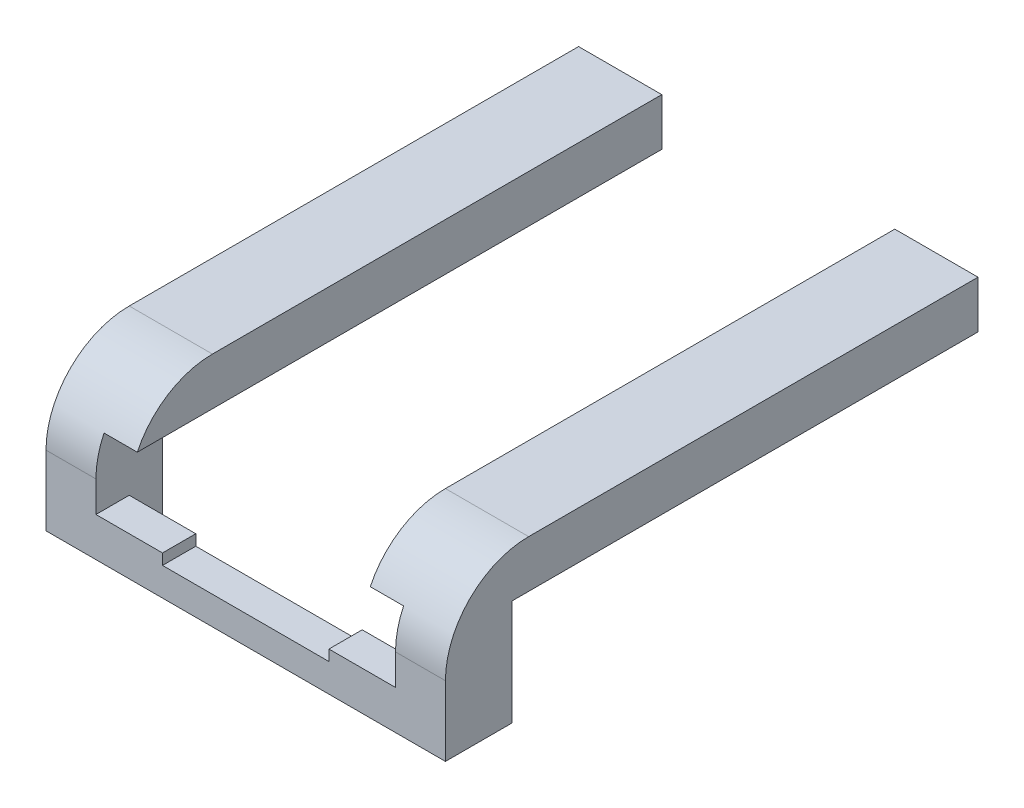
ISO-10303-21;
HEADER;
FILE_DESCRIPTION(('STEP AP214'),'2;1');
FILE_NAME('part.step','',(''),(''),'','','');
FILE_SCHEMA(('AUTOMOTIVE_DESIGN { 1 0 10303 214 1 1 1 1 }'));
ENDSEC;
DATA;
#1=APPLICATION_CONTEXT('core data for automotive mechanical design processes');
#2=APPLICATION_PROTOCOL_DEFINITION('international standard','automotive_design',2000,#1);
#3=PRODUCT_CONTEXT('',#1,'mechanical');
#4=PRODUCT('Part','Part','',(#3));
#5=PRODUCT_RELATED_PRODUCT_CATEGORY('part','',(#4));
#6=PRODUCT_DEFINITION_FORMATION('','',#4);
#7=PRODUCT_DEFINITION_CONTEXT('part definition',#1,'design');
#8=PRODUCT_DEFINITION('design','',#6,#7);
#9=PRODUCT_DEFINITION_SHAPE('','',#8);
#10=(LENGTH_UNIT() NAMED_UNIT(*) SI_UNIT(.MILLI.,.METRE.));
#11=(NAMED_UNIT(*) PLANE_ANGLE_UNIT() SI_UNIT($,.RADIAN.));
#12=(NAMED_UNIT(*) SI_UNIT($,.STERADIAN.) SOLID_ANGLE_UNIT());
#13=UNCERTAINTY_MEASURE_WITH_UNIT(LENGTH_MEASURE(1.E-05),#10,'distance_accuracy_value','');
#14=(GEOMETRIC_REPRESENTATION_CONTEXT(3) GLOBAL_UNCERTAINTY_ASSIGNED_CONTEXT((#13)) GLOBAL_UNIT_ASSIGNED_CONTEXT((#10,
#11,#12)) REPRESENTATION_CONTEXT('',''));
#15=CARTESIAN_POINT('',(0.,0.,0.));
#16=DIRECTION('',(0.,0.,1.));
#17=DIRECTION('',(1.,0.,0.));
#18=AXIS2_PLACEMENT_3D('',#15,#16,#17);
#19=CARTESIAN_POINT('',(0.,1.7,0.));
#20=DIRECTION('',(0.,1.,0.));
#21=DIRECTION('',(0.,0.,1.));
#22=AXIS2_PLACEMENT_3D('',#19,#20,#21);
#23=PLANE('',#22);
#24=DIRECTION('',(1.,0.,0.));
#25=VECTOR('',#24,1.);
#26=CARTESIAN_POINT('',(-12.,1.7,0.));
#27=LINE('',#26,#25);
#28=CARTESIAN_POINT('',(-5.,1.7,0.));
#29=VERTEX_POINT('',#28);
#30=CARTESIAN_POINT('',(5.,1.7,0.));
#31=VERTEX_POINT('',#30);
#32=EDGE_CURVE('E48',#29,#31,#27,.T.);
#33=ORIENTED_EDGE('',*,*,#32,.T.);
#34=DIRECTION('',(0.,0.,1.));
#35=VECTOR('',#34,1.);
#36=CARTESIAN_POINT('',(5.,1.7,0.));
#37=LINE('',#36,#35);
#38=CARTESIAN_POINT('',(5.,1.7,-2.));
#39=VERTEX_POINT('',#38);
#40=EDGE_CURVE('E207',#39,#31,#37,.T.);
#41=ORIENTED_EDGE('',*,*,#40,.F.);
#42=DIRECTION('',(-1.,0.,0.));
#43=VECTOR('',#42,1.);
#44=CARTESIAN_POINT('',(-9.,1.7,-2.));
#45=LINE('',#44,#43);
#46=CARTESIAN_POINT('',(-5.,1.7,-2.));
#47=VERTEX_POINT('',#46);
#48=EDGE_CURVE('E195',#39,#47,#45,.T.);
#49=ORIENTED_EDGE('',*,*,#48,.T.);
#50=DIRECTION('',(0.,0.,-1.));
#51=VECTOR('',#50,1.);
#52=CARTESIAN_POINT('',(-5.,1.7,0.));
#53=LINE('',#52,#51);
#54=EDGE_CURVE('E197',#29,#47,#53,.T.);
#55=ORIENTED_EDGE('',*,*,#54,.F.);
#56=EDGE_LOOP('',(#33,#41,#49,#55));
#57=FACE_BOUND('',#56,.T.);
#58=ADVANCED_FACE('F33',(#57),#23,.T.);
#59=CARTESIAN_POINT('',(9.,1.7,-4.));
#60=DIRECTION('',(1.,0.,0.));
#61=DIRECTION('',(0.,0.,-1.));
#62=AXIS2_PLACEMENT_3D('',#59,#60,#61);
#63=PLANE('',#62);
#64=DIRECTION('',(0.,-1.,0.));
#65=VECTOR('',#64,1.);
#66=CARTESIAN_POINT('',(9.,1.7,-2.));
#67=LINE('',#66,#65);
#68=CARTESIAN_POINT('',(9.,2.35,-2.));
#69=VERTEX_POINT('',#68);
#70=CARTESIAN_POINT('',(9.,0.,-2.));
#71=VERTEX_POINT('',#70);
#72=EDGE_CURVE('E56',#69,#71,#67,.T.);
#73=ORIENTED_EDGE('',*,*,#72,.F.);
#74=DIRECTION('',(0.,0.,-1.));
#75=VECTOR('',#74,1.);
#76=CARTESIAN_POINT('',(9.,2.35,0.));
#77=LINE('',#76,#75);
#78=CARTESIAN_POINT('',(9.,2.35,0.));
#79=VERTEX_POINT('',#78);
#80=EDGE_CURVE('E188',#79,#69,#77,.T.);
#81=ORIENTED_EDGE('',*,*,#80,.F.);
#82=DIRECTION('',(0.,-1.,0.));
#83=VECTOR('',#82,1.);
#84=CARTESIAN_POINT('',(9.,9.2,0.));
#85=LINE('',#84,#83);
#86=CARTESIAN_POINT('',(9.,4.2,0.));
#87=VERTEX_POINT('',#86);
#88=EDGE_CURVE('E273',#87,#79,#85,.T.);
#89=ORIENTED_EDGE('',*,*,#88,.F.);
#90=CARTESIAN_POINT('',(9.,4.2,-5.));
#91=DIRECTION('',(1.,0.,0.));
#92=DIRECTION('',(0.,0.,-1.));
#93=AXIS2_PLACEMENT_3D('',#90,#91,#92);
#94=CIRCLE('',#93,5.);
#95=CARTESIAN_POINT('',(9.00000000000001,6.35,-0.485855562789335));
#96=VERTEX_POINT('',#95);
#97=EDGE_CURVE('E335',#87,#96,#94,.F.);
#98=ORIENTED_EDGE('',*,*,#97,.T.);
#99=DIRECTION('',(0.,0.,-1.));
#100=VECTOR('',#99,1.);
#101=CARTESIAN_POINT('',(9.,6.35,-4.));
#102=LINE('',#101,#100);
#103=CARTESIAN_POINT('',(9.,6.35,-4.));
#104=VERTEX_POINT('',#103);
#105=EDGE_CURVE('E324',#96,#104,#102,.T.);
#106=ORIENTED_EDGE('',*,*,#105,.T.);
#107=DIRECTION('',(0.,-1.,0.));
#108=VECTOR('',#107,1.);
#109=CARTESIAN_POINT('',(9.,1.7,-4.));
#110=LINE('',#109,#108);
#111=CARTESIAN_POINT('',(9.,0.,-4.));
#112=VERTEX_POINT('',#111);
#113=EDGE_CURVE('E313',#104,#112,#110,.T.);
#114=ORIENTED_EDGE('',*,*,#113,.T.);
#115=DIRECTION('',(0.,0.,1.));
#116=VECTOR('',#115,1.);
#117=CARTESIAN_POINT('',(9.,0.,-4.));
#118=LINE('',#117,#116);
#119=EDGE_CURVE('E297',#112,#71,#118,.T.);
#120=ORIENTED_EDGE('',*,*,#119,.T.);
#121=EDGE_LOOP('',(#73,#81,#89,#98,#106,#114,#120));
#122=FACE_BOUND('',#121,.T.);
#123=ADVANCED_FACE('F400',(#122),#63,.F.);
#124=CARTESIAN_POINT('',(-9.,1.7,-4.));
#125=DIRECTION('',(-1.,0.,0.));
#126=DIRECTION('',(0.,0.,1.));
#127=AXIS2_PLACEMENT_3D('',#124,#125,#126);
#128=PLANE('',#127);
#129=DIRECTION('',(0.,0.,1.));
#130=VECTOR('',#129,1.);
#131=CARTESIAN_POINT('',(-9.,2.35,0.));
#132=LINE('',#131,#130);
#133=CARTESIAN_POINT('',(-9.,2.35,-2.));
#134=VERTEX_POINT('',#133);
#135=CARTESIAN_POINT('',(-9.,2.35,0.));
#136=VERTEX_POINT('',#135);
#137=EDGE_CURVE('E210',#134,#136,#132,.T.);
#138=ORIENTED_EDGE('',*,*,#137,.F.);
#139=DIRECTION('',(0.,-1.,0.));
#140=VECTOR('',#139,1.);
#141=CARTESIAN_POINT('',(-9.,1.7,-2.));
#142=LINE('',#141,#140);
#143=CARTESIAN_POINT('',(-9.,0.,-2.));
#144=VERTEX_POINT('',#143);
#145=EDGE_CURVE('E309',#134,#144,#142,.T.);
#146=ORIENTED_EDGE('',*,*,#145,.T.);
#147=DIRECTION('',(0.,0.,-1.));
#148=VECTOR('',#147,1.);
#149=CARTESIAN_POINT('',(-9.,0.,-4.));
#150=LINE('',#149,#148);
#151=CARTESIAN_POINT('',(-9.,0.,-4.));
#152=VERTEX_POINT('',#151);
#153=EDGE_CURVE('E301',#144,#152,#150,.T.);
#154=ORIENTED_EDGE('',*,*,#153,.T.);
#155=DIRECTION('',(0.,-1.,0.));
#156=VECTOR('',#155,1.);
#157=CARTESIAN_POINT('',(-9.,1.7,-4.));
#158=LINE('',#157,#156);
#159=CARTESIAN_POINT('',(-9.,6.35,-4.));
#160=VERTEX_POINT('',#159);
#161=EDGE_CURVE('E307',#160,#152,#158,.T.);
#162=ORIENTED_EDGE('',*,*,#161,.F.);
#163=DIRECTION('',(0.,0.,1.));
#164=VECTOR('',#163,1.);
#165=CARTESIAN_POINT('',(-9.,6.35,-4.));
#166=LINE('',#165,#164);
#167=CARTESIAN_POINT('',(-9.00000000000001,6.35,-0.485855562789335));
#168=VERTEX_POINT('',#167);
#169=EDGE_CURVE('E266',#160,#168,#166,.T.);
#170=ORIENTED_EDGE('',*,*,#169,.T.);
#171=CARTESIAN_POINT('',(-9.,4.2,-5.));
#172=DIRECTION('',(-1.,0.,0.));
#173=DIRECTION('',(0.,0.,1.));
#174=AXIS2_PLACEMENT_3D('',#171,#172,#173);
#175=CIRCLE('',#174,5.);
#176=CARTESIAN_POINT('',(-9.,4.2,0.));
#177=VERTEX_POINT('',#176);
#178=EDGE_CURVE('E41',#168,#177,#175,.F.);
#179=ORIENTED_EDGE('',*,*,#178,.T.);
#180=DIRECTION('',(0.,-1.,0.));
#181=VECTOR('',#180,1.);
#182=CARTESIAN_POINT('',(-9.,9.2,0.));
#183=LINE('',#182,#181);
#184=EDGE_CURVE('E279',#177,#136,#183,.T.);
#185=ORIENTED_EDGE('',*,*,#184,.T.);
#186=EDGE_LOOP('',(#138,#146,#154,#162,#170,#179,#185));
#187=FACE_BOUND('',#186,.T.);
#188=ADVANCED_FACE('F351',(#187),#128,.F.);
#189=CARTESIAN_POINT('',(-12.,1.7,-4.));
#190=DIRECTION('',(1.,0.,0.));
#191=DIRECTION('',(0.,0.,-1.));
#192=AXIS2_PLACEMENT_3D('',#189,#190,#191);
#193=PLANE('',#192);
#194=DIRECTION('',(0.,-1.,0.));
#195=VECTOR('',#194,1.);
#196=CARTESIAN_POINT('',(-12.,1.7,0.));
#197=LINE('',#196,#195);
#198=CARTESIAN_POINT('',(-12.,4.2,0.));
#199=VERTEX_POINT('',#198);
#200=CARTESIAN_POINT('',(-12.,0.,0.));
#201=VERTEX_POINT('',#200);
#202=EDGE_CURVE('E319',#199,#201,#197,.T.);
#203=ORIENTED_EDGE('',*,*,#202,.F.);
#204=CARTESIAN_POINT('',(-12.,4.2,-5.));
#205=DIRECTION('',(1.,0.,0.));
#206=DIRECTION('',(0.,0.,-1.));
#207=AXIS2_PLACEMENT_3D('',#204,#205,#206);
#208=CIRCLE('',#207,5.);
#209=CARTESIAN_POINT('',(-12.,9.2,-5.));
#210=VERTEX_POINT('',#209);
#211=EDGE_CURVE('E11',#199,#210,#208,.F.);
#212=ORIENTED_EDGE('',*,*,#211,.T.);
#213=DIRECTION('',(0.,0.,1.));
#214=VECTOR('',#213,1.);
#215=CARTESIAN_POINT('',(-12.,9.2,-4.));
#216=LINE('',#215,#214);
#217=CARTESIAN_POINT('',(-12.,9.2,-32.));
#218=VERTEX_POINT('',#217);
#219=EDGE_CURVE('E276',#218,#210,#216,.T.);
#220=ORIENTED_EDGE('',*,*,#219,.F.);
#221=DIRECTION('',(0.,1.,0.));
#222=VECTOR('',#221,1.);
#223=CARTESIAN_POINT('',(-12.,6.35,-32.));
#224=LINE('',#223,#222);
#225=CARTESIAN_POINT('',(-12.,6.35,-32.));
#226=VERTEX_POINT('',#225);
#227=EDGE_CURVE('E263',#226,#218,#224,.T.);
#228=ORIENTED_EDGE('',*,*,#227,.F.);
#229=DIRECTION('',(0.,0.,1.));
#230=VECTOR('',#229,1.);
#231=CARTESIAN_POINT('',(-12.,6.35,0.));
#232=LINE('',#231,#230);
#233=CARTESIAN_POINT('',(-12.,6.35,-4.));
#234=VERTEX_POINT('',#233);
#235=EDGE_CURVE('E250',#226,#234,#232,.T.);
#236=ORIENTED_EDGE('',*,*,#235,.T.);
#237=DIRECTION('',(0.,-1.,0.));
#238=VECTOR('',#237,1.);
#239=CARTESIAN_POINT('',(-12.,1.7,-4.));
#240=LINE('',#239,#238);
#241=CARTESIAN_POINT('',(-12.,0.,-4.));
#242=VERTEX_POINT('',#241);
#243=EDGE_CURVE('E285',#234,#242,#240,.T.);
#244=ORIENTED_EDGE('',*,*,#243,.T.);
#245=DIRECTION('',(0.,0.,1.));
#246=VECTOR('',#245,1.);
#247=CARTESIAN_POINT('',(-12.,0.,-4.));
#248=LINE('',#247,#246);
#249=EDGE_CURVE('E281',#242,#201,#248,.T.);
#250=ORIENTED_EDGE('',*,*,#249,.T.);
#251=EDGE_LOOP('',(#203,#212,#220,#228,#236,#244,#250));
#252=FACE_BOUND('',#251,.T.);
#253=ADVANCED_FACE('F364',(#252),#193,.F.);
#254=CARTESIAN_POINT('',(-12.,1.7,0.));
#255=DIRECTION('',(0.,0.,-1.));
#256=DIRECTION('',(-1.,0.,0.));
#257=AXIS2_PLACEMENT_3D('',#254,#255,#256);
#258=PLANE('',#257);
#259=ORIENTED_EDGE('',*,*,#32,.F.);
#260=DIRECTION('',(0.,-1.,0.));
#261=VECTOR('',#260,1.);
#262=CARTESIAN_POINT('',(-5.,2.35,0.));
#263=LINE('',#262,#261);
#264=CARTESIAN_POINT('',(-5.,2.35,0.));
#265=VERTEX_POINT('',#264);
#266=EDGE_CURVE('E224',#265,#29,#263,.T.);
#267=ORIENTED_EDGE('',*,*,#266,.F.);
#268=DIRECTION('',(1.,0.,0.));
#269=VECTOR('',#268,1.);
#270=CARTESIAN_POINT('',(-9.,2.35,0.));
#271=LINE('',#270,#269);
#272=EDGE_CURVE('E213',#136,#265,#271,.T.);
#273=ORIENTED_EDGE('',*,*,#272,.F.);
#274=ORIENTED_EDGE('',*,*,#184,.F.);
#275=DIRECTION('',(1.,0.,0.));
#276=VECTOR('',#275,1.);
#277=CARTESIAN_POINT('',(-12.,4.2,0.));
#278=LINE('',#277,#276);
#279=EDGE_CURVE('E331',#177,#199,#278,.F.);
#280=ORIENTED_EDGE('',*,*,#279,.T.);
#281=ORIENTED_EDGE('',*,*,#202,.T.);
#282=DIRECTION('',(1.,0.,0.));
#283=VECTOR('',#282,1.);
#284=CARTESIAN_POINT('',(-12.,0.,0.));
#285=LINE('',#284,#283);
#286=CARTESIAN_POINT('',(12.,0.,0.));
#287=VERTEX_POINT('',#286);
#288=EDGE_CURVE('E288',#201,#287,#285,.T.);
#289=ORIENTED_EDGE('',*,*,#288,.T.);
#290=DIRECTION('',(0.,-1.,0.));
#291=VECTOR('',#290,1.);
#292=CARTESIAN_POINT('',(12.,1.7,0.));
#293=LINE('',#292,#291);
#294=CARTESIAN_POINT('',(12.,4.2,0.));
#295=VERTEX_POINT('',#294);
#296=EDGE_CURVE('E317',#295,#287,#293,.T.);
#297=ORIENTED_EDGE('',*,*,#296,.F.);
#298=DIRECTION('',(1.,0.,0.));
#299=VECTOR('',#298,1.);
#300=CARTESIAN_POINT('',(7.,4.2,0.));
#301=LINE('',#300,#299);
#302=EDGE_CURVE('E333',#295,#87,#301,.F.);
#303=ORIENTED_EDGE('',*,*,#302,.T.);
#304=ORIENTED_EDGE('',*,*,#88,.T.);
#305=DIRECTION('',(1.,0.,0.));
#306=VECTOR('',#305,1.);
#307=CARTESIAN_POINT('',(9.,2.35,0.));
#308=LINE('',#307,#306);
#309=CARTESIAN_POINT('',(5.,2.35,0.));
#310=VERTEX_POINT('',#309);
#311=EDGE_CURVE('E208',#310,#79,#308,.T.);
#312=ORIENTED_EDGE('',*,*,#311,.F.);
#313=DIRECTION('',(0.,-1.,0.));
#314=VECTOR('',#313,1.);
#315=CARTESIAN_POINT('',(5.,2.35,0.));
#316=LINE('',#315,#314);
#317=EDGE_CURVE('E198',#310,#31,#316,.T.);
#318=ORIENTED_EDGE('',*,*,#317,.T.);
#319=EDGE_LOOP('',(#259,#267,#273,#274,#280,#281,#289,#297,#303,#304,#312,#318));
#320=FACE_BOUND('',#319,.T.);
#321=ADVANCED_FACE('F358',(#320),#258,.F.);
#322=CARTESIAN_POINT('',(12.,1.7,-4.));
#323=DIRECTION('',(-1.,0.,0.));
#324=DIRECTION('',(0.,0.,1.));
#325=AXIS2_PLACEMENT_3D('',#322,#323,#324);
#326=PLANE('',#325);
#327=DIRECTION('',(0.,0.,-1.));
#328=VECTOR('',#327,1.);
#329=CARTESIAN_POINT('',(12.,9.2,-4.));
#330=LINE('',#329,#328);
#331=CARTESIAN_POINT('',(12.,9.2,-5.));
#332=VERTEX_POINT('',#331);
#333=CARTESIAN_POINT('',(12.,9.2,-32.));
#334=VERTEX_POINT('',#333);
#335=EDGE_CURVE('E271',#332,#334,#330,.T.);
#336=ORIENTED_EDGE('',*,*,#335,.F.);
#337=CARTESIAN_POINT('',(12.,4.2,-5.));
#338=DIRECTION('',(-1.,0.,0.));
#339=DIRECTION('',(0.,0.,1.));
#340=AXIS2_PLACEMENT_3D('',#337,#338,#339);
#341=CIRCLE('',#340,5.);
#342=EDGE_CURVE('E329',#332,#295,#341,.F.);
#343=ORIENTED_EDGE('',*,*,#342,.T.);
#344=ORIENTED_EDGE('',*,*,#296,.T.);
#345=DIRECTION('',(0.,0.,-1.));
#346=VECTOR('',#345,1.);
#347=CARTESIAN_POINT('',(12.,0.,-4.));
#348=LINE('',#347,#346);
#349=CARTESIAN_POINT('',(12.,0.,-4.));
#350=VERTEX_POINT('',#349);
#351=EDGE_CURVE('E291',#287,#350,#348,.T.);
#352=ORIENTED_EDGE('',*,*,#351,.T.);
#353=DIRECTION('',(0.,-1.,0.));
#354=VECTOR('',#353,1.);
#355=CARTESIAN_POINT('',(12.,1.7,-4.));
#356=LINE('',#355,#354);
#357=CARTESIAN_POINT('',(12.,6.35,-4.));
#358=VERTEX_POINT('',#357);
#359=EDGE_CURVE('E315',#358,#350,#356,.T.);
#360=ORIENTED_EDGE('',*,*,#359,.F.);
#361=DIRECTION('',(0.,0.,-1.));
#362=VECTOR('',#361,1.);
#363=CARTESIAN_POINT('',(12.,6.35,0.));
#364=LINE('',#363,#362);
#365=CARTESIAN_POINT('',(12.,6.35,-32.));
#366=VERTEX_POINT('',#365);
#367=EDGE_CURVE('E228',#358,#366,#364,.T.);
#368=ORIENTED_EDGE('',*,*,#367,.T.);
#369=DIRECTION('',(0.,1.,0.));
#370=VECTOR('',#369,1.);
#371=CARTESIAN_POINT('',(12.,6.35,-32.));
#372=LINE('',#371,#370);
#373=EDGE_CURVE('E237',#366,#334,#372,.T.);
#374=ORIENTED_EDGE('',*,*,#373,.T.);
#375=EDGE_LOOP('',(#336,#343,#344,#352,#360,#368,#374));
#376=FACE_BOUND('',#375,.T.);
#377=ADVANCED_FACE('F439',(#376),#326,.F.);
#378=CARTESIAN_POINT('',(12.,1.7,-4.));
#379=DIRECTION('',(0.,0.,1.));
#380=DIRECTION('',(1.,0.,0.));
#381=AXIS2_PLACEMENT_3D('',#378,#379,#380);
#382=PLANE('',#381);
#383=ORIENTED_EDGE('',*,*,#113,.F.);
#384=DIRECTION('',(1.,0.,0.));
#385=VECTOR('',#384,1.);
#386=CARTESIAN_POINT('',(12.,6.35,-4.));
#387=LINE('',#386,#385);
#388=EDGE_CURVE('E244',#104,#358,#387,.T.);
#389=ORIENTED_EDGE('',*,*,#388,.T.);
#390=ORIENTED_EDGE('',*,*,#359,.T.);
#391=DIRECTION('',(-1.,0.,0.));
#392=VECTOR('',#391,1.);
#393=CARTESIAN_POINT('',(12.,0.,-4.));
#394=LINE('',#393,#392);
#395=EDGE_CURVE('E294',#350,#112,#394,.T.);
#396=ORIENTED_EDGE('',*,*,#395,.T.);
#397=EDGE_LOOP('',(#383,#389,#390,#396));
#398=FACE_BOUND('',#397,.T.);
#399=ADVANCED_FACE('F409',(#398),#382,.F.);
#400=CARTESIAN_POINT('',(-9.,1.7,-2.));
#401=DIRECTION('',(0.,0.,1.));
#402=DIRECTION('',(1.,0.,0.));
#403=AXIS2_PLACEMENT_3D('',#400,#401,#402);
#404=PLANE('',#403);
#405=DIRECTION('',(-1.,0.,0.));
#406=VECTOR('',#405,1.);
#407=CARTESIAN_POINT('',(-9.,0.,-2.));
#408=LINE('',#407,#406);
#409=EDGE_CURVE('E299',#71,#144,#408,.T.);
#410=ORIENTED_EDGE('',*,*,#409,.T.);
#411=ORIENTED_EDGE('',*,*,#145,.F.);
#412=DIRECTION('',(-1.,0.,0.));
#413=VECTOR('',#412,1.);
#414=CARTESIAN_POINT('',(-9.,2.35,-2.));
#415=LINE('',#414,#413);
#416=CARTESIAN_POINT('',(-5.,2.35,-2.));
#417=VERTEX_POINT('',#416);
#418=EDGE_CURVE('E217',#417,#134,#415,.T.);
#419=ORIENTED_EDGE('',*,*,#418,.F.);
#420=DIRECTION('',(0.,-1.,0.));
#421=VECTOR('',#420,1.);
#422=CARTESIAN_POINT('',(-5.,2.35,-2.));
#423=LINE('',#422,#421);
#424=EDGE_CURVE('E220',#417,#47,#423,.T.);
#425=ORIENTED_EDGE('',*,*,#424,.T.);
#426=ORIENTED_EDGE('',*,*,#48,.F.);
#427=DIRECTION('',(0.,-1.,0.));
#428=VECTOR('',#427,1.);
#429=CARTESIAN_POINT('',(5.,2.35,-2.));
#430=LINE('',#429,#428);
#431=CARTESIAN_POINT('',(5.,2.35,-2.));
#432=VERTEX_POINT('',#431);
#433=EDGE_CURVE('E192',#432,#39,#430,.T.);
#434=ORIENTED_EDGE('',*,*,#433,.F.);
#435=DIRECTION('',(-1.,0.,0.));
#436=VECTOR('',#435,1.);
#437=CARTESIAN_POINT('',(9.,2.35,-2.));
#438=LINE('',#437,#436);
#439=EDGE_CURVE('E181',#69,#432,#438,.T.);
#440=ORIENTED_EDGE('',*,*,#439,.F.);
#441=ORIENTED_EDGE('',*,*,#72,.T.);
#442=EDGE_LOOP('',(#410,#411,#419,#425,#426,#434,#440,#441));
#443=FACE_BOUND('',#442,.T.);
#444=ADVANCED_FACE('F193',(#443),#404,.F.);
#445=CARTESIAN_POINT('',(-12.,1.7,-4.));
#446=DIRECTION('',(0.,0.,1.));
#447=DIRECTION('',(1.,0.,0.));
#448=AXIS2_PLACEMENT_3D('',#445,#446,#447);
#449=PLANE('',#448);
#450=ORIENTED_EDGE('',*,*,#243,.F.);
#451=DIRECTION('',(1.,0.,0.));
#452=VECTOR('',#451,1.);
#453=CARTESIAN_POINT('',(-12.,6.35,-4.));
#454=LINE('',#453,#452);
#455=EDGE_CURVE('E321',#234,#160,#454,.T.);
#456=ORIENTED_EDGE('',*,*,#455,.T.);
#457=ORIENTED_EDGE('',*,*,#161,.T.);
#458=DIRECTION('',(-1.,0.,0.));
#459=VECTOR('',#458,1.);
#460=CARTESIAN_POINT('',(-12.,0.,-4.));
#461=LINE('',#460,#459);
#462=EDGE_CURVE('E283',#152,#242,#461,.T.);
#463=ORIENTED_EDGE('',*,*,#462,.T.);
#464=EDGE_LOOP('',(#450,#456,#457,#463));
#465=FACE_BOUND('',#464,.T.);
#466=ADVANCED_FACE('F379',(#465),#449,.F.);
#467=CARTESIAN_POINT('',(0.,0.,0.));
#468=DIRECTION('',(0.,1.,0.));
#469=DIRECTION('',(0.,0.,1.));
#470=AXIS2_PLACEMENT_3D('',#467,#468,#469);
#471=PLANE('',#470);
#472=ORIENTED_EDGE('',*,*,#249,.F.);
#473=ORIENTED_EDGE('',*,*,#462,.F.);
#474=ORIENTED_EDGE('',*,*,#153,.F.);
#475=ORIENTED_EDGE('',*,*,#409,.F.);
#476=ORIENTED_EDGE('',*,*,#119,.F.);
#477=ORIENTED_EDGE('',*,*,#395,.F.);
#478=ORIENTED_EDGE('',*,*,#351,.F.);
#479=ORIENTED_EDGE('',*,*,#288,.F.);
#480=EDGE_LOOP('',(#472,#473,#474,#475,#476,#477,#478,#479));
#481=FACE_BOUND('',#480,.T.);
#482=ADVANCED_FACE('F385',(#481),#471,.F.);
#483=CARTESIAN_POINT('',(0.,9.2,0.));
#484=DIRECTION('',(0.,1.,0.));
#485=DIRECTION('',(0.,0.,1.));
#486=AXIS2_PLACEMENT_3D('',#483,#484,#485);
#487=PLANE('',#486);
#488=ORIENTED_EDGE('',*,*,#219,.T.);
#489=DIRECTION('',(1.,0.,0.));
#490=VECTOR('',#489,1.);
#491=CARTESIAN_POINT('',(-7.,9.2,-5.));
#492=LINE('',#491,#490);
#493=CARTESIAN_POINT('',(-7.,9.2,-5.));
#494=VERTEX_POINT('',#493);
#495=EDGE_CURVE('E341',#210,#494,#492,.T.);
#496=ORIENTED_EDGE('',*,*,#495,.T.);
#497=DIRECTION('',(0.,0.,-1.));
#498=VECTOR('',#497,1.);
#499=CARTESIAN_POINT('',(-7.,9.2,0.));
#500=LINE('',#499,#498);
#501=CARTESIAN_POINT('',(-7.,9.2,-32.));
#502=VERTEX_POINT('',#501);
#503=EDGE_CURVE('E249',#494,#502,#500,.T.);
#504=ORIENTED_EDGE('',*,*,#503,.T.);
#505=DIRECTION('',(-1.,0.,0.));
#506=VECTOR('',#505,1.);
#507=CARTESIAN_POINT('',(-12.,9.2,-32.));
#508=LINE('',#507,#506);
#509=EDGE_CURVE('E254',#502,#218,#508,.T.);
#510=ORIENTED_EDGE('',*,*,#509,.T.);
#511=EDGE_LOOP('',(#488,#496,#504,#510));
#512=FACE_BOUND('',#511,.T.);
#513=ADVANCED_FACE('F366',(#512),#487,.T.);
#514=CARTESIAN_POINT('',(0.,9.2,0.));
#515=DIRECTION('',(0.,1.,0.));
#516=DIRECTION('',(0.,0.,1.));
#517=AXIS2_PLACEMENT_3D('',#514,#515,#516);
#518=PLANE('',#517);
#519=DIRECTION('',(0.,0.,1.));
#520=VECTOR('',#519,1.);
#521=CARTESIAN_POINT('',(7.,9.2,0.));
#522=LINE('',#521,#520);
#523=CARTESIAN_POINT('',(7.,9.2,-32.));
#524=VERTEX_POINT('',#523);
#525=CARTESIAN_POINT('',(7.,9.2,-5.));
#526=VERTEX_POINT('',#525);
#527=EDGE_CURVE('E231',#524,#526,#522,.T.);
#528=ORIENTED_EDGE('',*,*,#527,.T.);
#529=DIRECTION('',(1.,0.,0.));
#530=VECTOR('',#529,1.);
#531=CARTESIAN_POINT('',(12.,9.2,-5.));
#532=LINE('',#531,#530);
#533=EDGE_CURVE('E326',#526,#332,#532,.T.);
#534=ORIENTED_EDGE('',*,*,#533,.T.);
#535=ORIENTED_EDGE('',*,*,#335,.T.);
#536=DIRECTION('',(-1.,0.,0.));
#537=VECTOR('',#536,1.);
#538=CARTESIAN_POINT('',(12.,9.2,-32.));
#539=LINE('',#538,#537);
#540=EDGE_CURVE('E227',#334,#524,#539,.T.);
#541=ORIENTED_EDGE('',*,*,#540,.T.);
#542=EDGE_LOOP('',(#528,#534,#535,#541));
#543=FACE_BOUND('',#542,.T.);
#544=ADVANCED_FACE('F464',(#543),#518,.T.);
#545=CARTESIAN_POINT('',(0.,6.35,0.));
#546=DIRECTION('',(0.,-1.,0.));
#547=DIRECTION('',(0.,0.,-1.));
#548=AXIS2_PLACEMENT_3D('',#545,#546,#547);
#549=PLANE('',#548);
#550=DIRECTION('',(0.,0.,-1.));
#551=VECTOR('',#550,1.);
#552=CARTESIAN_POINT('',(-7.,6.35,0.));
#553=LINE('',#552,#551);
#554=CARTESIAN_POINT('',(-7.,6.35,-0.485855562789335));
#555=VERTEX_POINT('',#554);
#556=CARTESIAN_POINT('',(-7.,6.35,-32.));
#557=VERTEX_POINT('',#556);
#558=EDGE_CURVE('E253',#555,#557,#553,.T.);
#559=ORIENTED_EDGE('',*,*,#558,.F.);
#560=DIRECTION('',(-1.,0.,0.));
#561=VECTOR('',#560,1.);
#562=CARTESIAN_POINT('',(-7.,6.35,-0.485855562789335));
#563=LINE('',#562,#561);
#564=EDGE_CURVE('E346',#555,#168,#563,.T.);
#565=ORIENTED_EDGE('',*,*,#564,.T.);
#566=ORIENTED_EDGE('',*,*,#169,.F.);
#567=ORIENTED_EDGE('',*,*,#455,.F.);
#568=ORIENTED_EDGE('',*,*,#235,.F.);
#569=DIRECTION('',(-1.,0.,0.));
#570=VECTOR('',#569,1.);
#571=CARTESIAN_POINT('',(-12.,6.35,-32.));
#572=LINE('',#571,#570);
#573=EDGE_CURVE('E256',#557,#226,#572,.T.);
#574=ORIENTED_EDGE('',*,*,#573,.F.);
#575=EDGE_LOOP('',(#559,#565,#566,#567,#568,#574));
#576=FACE_BOUND('',#575,.T.);
#577=ADVANCED_FACE('F377',(#576),#549,.T.);
#578=CARTESIAN_POINT('',(-12.,6.35,-32.));
#579=DIRECTION('',(0.,0.,-1.));
#580=DIRECTION('',(-1.,0.,0.));
#581=AXIS2_PLACEMENT_3D('',#578,#579,#580);
#582=PLANE('',#581);
#583=ORIENTED_EDGE('',*,*,#509,.F.);
#584=DIRECTION('',(0.,1.,0.));
#585=VECTOR('',#584,1.);
#586=CARTESIAN_POINT('',(-7.,6.35,-32.));
#587=LINE('',#586,#585);
#588=EDGE_CURVE('E259',#557,#502,#587,.T.);
#589=ORIENTED_EDGE('',*,*,#588,.F.);
#590=ORIENTED_EDGE('',*,*,#573,.T.);
#591=ORIENTED_EDGE('',*,*,#227,.T.);
#592=EDGE_LOOP('',(#583,#589,#590,#591));
#593=FACE_BOUND('',#592,.T.);
#594=ADVANCED_FACE('F371',(#593),#582,.T.);
#595=CARTESIAN_POINT('',(-7.,6.35,0.));
#596=DIRECTION('',(1.,0.,0.));
#597=DIRECTION('',(0.,0.,-1.));
#598=AXIS2_PLACEMENT_3D('',#595,#596,#597);
#599=PLANE('',#598);
#600=ORIENTED_EDGE('',*,*,#503,.F.);
#601=CARTESIAN_POINT('',(-7.,4.2,-5.));
#602=DIRECTION('',(1.,0.,0.));
#603=DIRECTION('',(0.,0.,-1.));
#604=AXIS2_PLACEMENT_3D('',#601,#602,#603);
#605=CIRCLE('',#604,5.);
#606=EDGE_CURVE('E344',#494,#555,#605,.T.);
#607=ORIENTED_EDGE('',*,*,#606,.T.);
#608=ORIENTED_EDGE('',*,*,#558,.T.);
#609=ORIENTED_EDGE('',*,*,#588,.T.);
#610=EDGE_LOOP('',(#600,#607,#608,#609));
#611=FACE_BOUND('',#610,.T.);
#612=ADVANCED_FACE('F467',(#611),#599,.T.);
#613=CARTESIAN_POINT('',(0.,6.35,0.));
#614=DIRECTION('',(0.,-1.,0.));
#615=DIRECTION('',(0.,0.,-1.));
#616=AXIS2_PLACEMENT_3D('',#613,#614,#615);
#617=PLANE('',#616);
#618=ORIENTED_EDGE('',*,*,#105,.F.);
#619=DIRECTION('',(-1.,0.,0.));
#620=VECTOR('',#619,1.);
#621=CARTESIAN_POINT('',(9.00000000000001,6.35,-0.485855562789335));
#622=LINE('',#621,#620);
#623=CARTESIAN_POINT('',(7.,6.35,-0.485855562789335));
#624=VERTEX_POINT('',#623);
#625=EDGE_CURVE('E337',#96,#624,#622,.T.);
#626=ORIENTED_EDGE('',*,*,#625,.T.);
#627=DIRECTION('',(0.,0.,1.));
#628=VECTOR('',#627,1.);
#629=CARTESIAN_POINT('',(7.,6.35,0.));
#630=LINE('',#629,#628);
#631=CARTESIAN_POINT('',(7.,6.35,-32.));
#632=VERTEX_POINT('',#631);
#633=EDGE_CURVE('E234',#632,#624,#630,.T.);
#634=ORIENTED_EDGE('',*,*,#633,.F.);
#635=DIRECTION('',(-1.,0.,0.));
#636=VECTOR('',#635,1.);
#637=CARTESIAN_POINT('',(12.,6.35,-32.));
#638=LINE('',#637,#636);
#639=EDGE_CURVE('E230',#366,#632,#638,.T.);
#640=ORIENTED_EDGE('',*,*,#639,.F.);
#641=ORIENTED_EDGE('',*,*,#367,.F.);
#642=ORIENTED_EDGE('',*,*,#388,.F.);
#643=EDGE_LOOP('',(#618,#626,#634,#640,#641,#642));
#644=FACE_BOUND('',#643,.T.);
#645=ADVANCED_FACE('F403',(#644),#617,.T.);
#646=CARTESIAN_POINT('',(7.,6.35,0.));
#647=DIRECTION('',(-1.,0.,0.));
#648=DIRECTION('',(0.,0.,1.));
#649=AXIS2_PLACEMENT_3D('',#646,#647,#648);
#650=PLANE('',#649);
#651=ORIENTED_EDGE('',*,*,#633,.T.);
#652=CARTESIAN_POINT('',(7.,4.2,-5.));
#653=DIRECTION('',(-1.,0.,0.));
#654=DIRECTION('',(0.,0.,1.));
#655=AXIS2_PLACEMENT_3D('',#652,#653,#654);
#656=CIRCLE('',#655,5.);
#657=EDGE_CURVE('E339',#624,#526,#656,.T.);
#658=ORIENTED_EDGE('',*,*,#657,.T.);
#659=ORIENTED_EDGE('',*,*,#527,.F.);
#660=DIRECTION('',(0.,1.,0.));
#661=VECTOR('',#660,1.);
#662=CARTESIAN_POINT('',(7.,6.35,-32.));
#663=LINE('',#662,#661);
#664=EDGE_CURVE('E242',#632,#524,#663,.T.);
#665=ORIENTED_EDGE('',*,*,#664,.F.);
#666=EDGE_LOOP('',(#651,#658,#659,#665));
#667=FACE_BOUND('',#666,.T.);
#668=ADVANCED_FACE('F451',(#667),#650,.T.);
#669=CARTESIAN_POINT('',(12.,6.35,-32.));
#670=DIRECTION('',(0.,0.,-1.));
#671=DIRECTION('',(-1.,0.,0.));
#672=AXIS2_PLACEMENT_3D('',#669,#670,#671);
#673=PLANE('',#672);
#674=ORIENTED_EDGE('',*,*,#540,.F.);
#675=ORIENTED_EDGE('',*,*,#373,.F.);
#676=ORIENTED_EDGE('',*,*,#639,.T.);
#677=ORIENTED_EDGE('',*,*,#664,.T.);
#678=EDGE_LOOP('',(#674,#675,#676,#677));
#679=FACE_BOUND('',#678,.T.);
#680=ADVANCED_FACE('F446',(#679),#673,.T.);
#681=CARTESIAN_POINT('',(0.,4.2,-5.));
#682=DIRECTION('',(-1.,0.,0.));
#683=DIRECTION('',(0.,0.,1.));
#684=AXIS2_PLACEMENT_3D('',#681,#682,#683);
#685=CYLINDRICAL_SURFACE('',#684,5.);
#686=ORIENTED_EDGE('',*,*,#97,.F.);
#687=ORIENTED_EDGE('',*,*,#302,.F.);
#688=ORIENTED_EDGE('',*,*,#342,.F.);
#689=ORIENTED_EDGE('',*,*,#533,.F.);
#690=ORIENTED_EDGE('',*,*,#657,.F.);
#691=ORIENTED_EDGE('',*,*,#625,.F.);
#692=EDGE_LOOP('',(#686,#687,#688,#689,#690,#691));
#693=FACE_BOUND('',#692,.T.);
#694=ADVANCED_FACE('F395',(#693),#685,.T.);
#695=CARTESIAN_POINT('',(0.,4.2,-5.));
#696=DIRECTION('',(-1.,0.,0.));
#697=DIRECTION('',(0.,0.,1.));
#698=AXIS2_PLACEMENT_3D('',#695,#696,#697);
#699=CYLINDRICAL_SURFACE('',#698,5.);
#700=ORIENTED_EDGE('',*,*,#211,.F.);
#701=ORIENTED_EDGE('',*,*,#279,.F.);
#702=ORIENTED_EDGE('',*,*,#178,.F.);
#703=ORIENTED_EDGE('',*,*,#564,.F.);
#704=ORIENTED_EDGE('',*,*,#606,.F.);
#705=ORIENTED_EDGE('',*,*,#495,.F.);
#706=EDGE_LOOP('',(#700,#701,#702,#703,#704,#705));
#707=FACE_BOUND('',#706,.T.);
#708=ADVANCED_FACE('F35',(#707),#699,.T.);
#709=CARTESIAN_POINT('',(-5.,2.35,0.));
#710=DIRECTION('',(-1.,0.,0.));
#711=DIRECTION('',(0.,0.,1.));
#712=AXIS2_PLACEMENT_3D('',#709,#710,#711);
#713=PLANE('',#712);
#714=ORIENTED_EDGE('',*,*,#54,.T.);
#715=ORIENTED_EDGE('',*,*,#424,.F.);
#716=DIRECTION('',(0.,0.,-1.));
#717=VECTOR('',#716,1.);
#718=CARTESIAN_POINT('',(-5.,2.35,0.));
#719=LINE('',#718,#717);
#720=EDGE_CURVE('E215',#265,#417,#719,.T.);
#721=ORIENTED_EDGE('',*,*,#720,.F.);
#722=ORIENTED_EDGE('',*,*,#266,.T.);
#723=EDGE_LOOP('',(#714,#715,#721,#722));
#724=FACE_BOUND('',#723,.T.);
#725=ADVANCED_FACE('F417',(#724),#713,.F.);
#726=CARTESIAN_POINT('',(0.,2.35,0.));
#727=DIRECTION('',(0.,-1.,0.));
#728=DIRECTION('',(0.,0.,-1.));
#729=AXIS2_PLACEMENT_3D('',#726,#727,#728);
#730=PLANE('',#729);
#731=ORIENTED_EDGE('',*,*,#137,.T.);
#732=ORIENTED_EDGE('',*,*,#272,.T.);
#733=ORIENTED_EDGE('',*,*,#720,.T.);
#734=ORIENTED_EDGE('',*,*,#418,.T.);
#735=EDGE_LOOP('',(#731,#732,#733,#734));
#736=FACE_BOUND('',#735,.T.);
#737=ADVANCED_FACE('F413',(#736),#730,.F.);
#738=CARTESIAN_POINT('',(5.,2.35,0.));
#739=DIRECTION('',(1.,0.,0.));
#740=DIRECTION('',(0.,0.,-1.));
#741=AXIS2_PLACEMENT_3D('',#738,#739,#740);
#742=PLANE('',#741);
#743=ORIENTED_EDGE('',*,*,#40,.T.);
#744=ORIENTED_EDGE('',*,*,#317,.F.);
#745=DIRECTION('',(0.,0.,1.));
#746=VECTOR('',#745,1.);
#747=CARTESIAN_POINT('',(5.,2.35,0.));
#748=LINE('',#747,#746);
#749=EDGE_CURVE('E186',#432,#310,#748,.T.);
#750=ORIENTED_EDGE('',*,*,#749,.F.);
#751=ORIENTED_EDGE('',*,*,#433,.T.);
#752=EDGE_LOOP('',(#743,#744,#750,#751));
#753=FACE_BOUND('',#752,.T.);
#754=ADVANCED_FACE('F200',(#753),#742,.F.);
#755=CARTESIAN_POINT('',(0.,2.35,0.));
#756=DIRECTION('',(0.,-1.,0.));
#757=DIRECTION('',(0.,0.,-1.));
#758=AXIS2_PLACEMENT_3D('',#755,#756,#757);
#759=PLANE('',#758);
#760=ORIENTED_EDGE('',*,*,#311,.T.);
#761=ORIENTED_EDGE('',*,*,#80,.T.);
#762=ORIENTED_EDGE('',*,*,#439,.T.);
#763=ORIENTED_EDGE('',*,*,#749,.T.);
#764=EDGE_LOOP('',(#760,#761,#762,#763));
#765=FACE_BOUND('',#764,.T.);
#766=ADVANCED_FACE('F184',(#765),#759,.F.);
#767=CLOSED_SHELL('',(#58,#123,#188,#253,#321,#377,#399,#444,#466,#482,#513,#544,#577,#594,#612,
#645,#668,#680,#694,#708,#725,#737,#754,#766));
#768=MANIFOLD_SOLID_BREP('B2',#767);
#769=ADVANCED_BREP_SHAPE_REPRESENTATION('',(#18,#768),#14);
#770=SHAPE_DEFINITION_REPRESENTATION(#9,#769);
ENDSEC;
END-ISO-10303-21;
